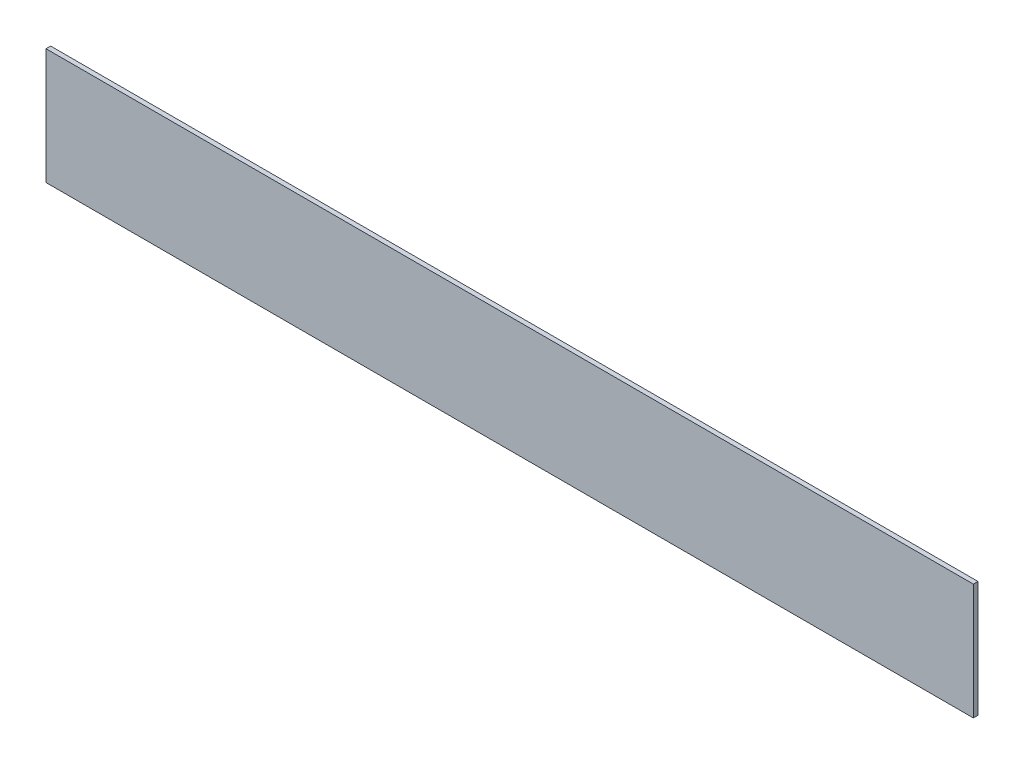
ISO-10303-21;
HEADER;
FILE_DESCRIPTION(('STEP AP214'),'2;1');
FILE_NAME('part.step','',(''),(''),'','','');
FILE_SCHEMA(('AUTOMOTIVE_DESIGN { 1 0 10303 214 1 1 1 1 }'));
ENDSEC;
DATA;
#1=APPLICATION_CONTEXT('core data for automotive mechanical design processes');
#2=APPLICATION_PROTOCOL_DEFINITION('international standard','automotive_design',2000,#1);
#3=PRODUCT_CONTEXT('',#1,'mechanical');
#4=PRODUCT('Part','Part','',(#3));
#5=PRODUCT_RELATED_PRODUCT_CATEGORY('part','',(#4));
#6=PRODUCT_DEFINITION_FORMATION('','',#4);
#7=PRODUCT_DEFINITION_CONTEXT('part definition',#1,'design');
#8=PRODUCT_DEFINITION('design','',#6,#7);
#9=PRODUCT_DEFINITION_SHAPE('','',#8);
#10=(LENGTH_UNIT() NAMED_UNIT(*) SI_UNIT(.MILLI.,.METRE.));
#11=(NAMED_UNIT(*) PLANE_ANGLE_UNIT() SI_UNIT($,.RADIAN.));
#12=(NAMED_UNIT(*) SI_UNIT($,.STERADIAN.) SOLID_ANGLE_UNIT());
#13=UNCERTAINTY_MEASURE_WITH_UNIT(LENGTH_MEASURE(1.E-05),#10,'distance_accuracy_value','');
#14=(GEOMETRIC_REPRESENTATION_CONTEXT(3) GLOBAL_UNCERTAINTY_ASSIGNED_CONTEXT((#13)) GLOBAL_UNIT_ASSIGNED_CONTEXT((#10,
#11,#12)) REPRESENTATION_CONTEXT('',''));
#15=CARTESIAN_POINT('',(0.,0.,0.));
#16=DIRECTION('',(0.,0.,1.));
#17=DIRECTION('',(1.,0.,0.));
#18=AXIS2_PLACEMENT_3D('',#15,#16,#17);
#19=CARTESIAN_POINT('',(0.,41.6,1.6));
#20=DIRECTION('',(1.,0.,0.));
#21=DIRECTION('',(0.,0.,-1.));
#22=AXIS2_PLACEMENT_3D('',#19,#20,#21);
#23=PLANE('',#22);
#24=DIRECTION('',(0.,-1.,0.));
#25=VECTOR('',#24,1.);
#26=CARTESIAN_POINT('',(0.,41.6,0.));
#27=LINE('',#26,#25);
#28=CARTESIAN_POINT('',(0.,81.6,0.));
#29=VERTEX_POINT('',#28);
#30=CARTESIAN_POINT('',(0.,41.6,0.));
#31=VERTEX_POINT('',#30);
#32=EDGE_CURVE('E102',#29,#31,#27,.T.);
#33=ORIENTED_EDGE('',*,*,#32,.T.);
#34=DIRECTION('',(0.,0.,-1.));
#35=VECTOR('',#34,1.);
#36=CARTESIAN_POINT('',(0.,41.6,1.6));
#37=LINE('',#36,#35);
#38=CARTESIAN_POINT('',(0.,41.6,1.6));
#39=VERTEX_POINT('',#38);
#40=EDGE_CURVE('E11',#39,#31,#37,.T.);
#41=ORIENTED_EDGE('',*,*,#40,.F.);
#42=DIRECTION('',(0.,-1.,0.));
#43=VECTOR('',#42,1.);
#44=CARTESIAN_POINT('',(0.,41.6,1.6));
#45=LINE('',#44,#43);
#46=CARTESIAN_POINT('',(0.,81.6,1.6));
#47=VERTEX_POINT('',#46);
#48=EDGE_CURVE('E90',#47,#39,#45,.T.);
#49=ORIENTED_EDGE('',*,*,#48,.F.);
#50=DIRECTION('',(0.,0.,-1.));
#51=VECTOR('',#50,1.);
#52=CARTESIAN_POINT('',(0.,81.6,1.6));
#53=LINE('',#52,#51);
#54=EDGE_CURVE('E98',#47,#29,#53,.T.);
#55=ORIENTED_EDGE('',*,*,#54,.T.);
#56=EDGE_LOOP('',(#33,#41,#49,#55));
#57=FACE_BOUND('',#56,.T.);
#58=ADVANCED_FACE('F39',(#57),#23,.F.);
#59=CARTESIAN_POINT('',(0.,41.6,1.6));
#60=DIRECTION('',(0.,1.,0.));
#61=DIRECTION('',(0.,0.,1.));
#62=AXIS2_PLACEMENT_3D('',#59,#60,#61);
#63=PLANE('',#62);
#64=DIRECTION('',(1.,0.,0.));
#65=VECTOR('',#64,1.);
#66=CARTESIAN_POINT('',(0.,41.6,0.));
#67=LINE('',#66,#65);
#68=CARTESIAN_POINT('',(320.,41.6,0.));
#69=VERTEX_POINT('',#68);
#70=EDGE_CURVE('E94',#31,#69,#67,.T.);
#71=ORIENTED_EDGE('',*,*,#70,.T.);
#72=DIRECTION('',(0.,0.,-1.));
#73=VECTOR('',#72,1.);
#74=CARTESIAN_POINT('',(320.,41.6,1.6));
#75=LINE('',#74,#73);
#76=CARTESIAN_POINT('',(320.,41.6,1.6));
#77=VERTEX_POINT('',#76);
#78=EDGE_CURVE('E47',#77,#69,#75,.T.);
#79=ORIENTED_EDGE('',*,*,#78,.F.);
#80=DIRECTION('',(1.,0.,0.));
#81=VECTOR('',#80,1.);
#82=CARTESIAN_POINT('',(0.,41.6,1.6));
#83=LINE('',#82,#81);
#84=EDGE_CURVE('E85',#39,#77,#83,.T.);
#85=ORIENTED_EDGE('',*,*,#84,.F.);
#86=ORIENTED_EDGE('',*,*,#40,.T.);
#87=EDGE_LOOP('',(#71,#79,#85,#86));
#88=FACE_BOUND('',#87,.T.);
#89=ADVANCED_FACE('F93',(#88),#63,.F.);
#90=CARTESIAN_POINT('',(320.,41.6,1.6));
#91=DIRECTION('',(-1.,0.,0.));
#92=DIRECTION('',(0.,0.,1.));
#93=AXIS2_PLACEMENT_3D('',#90,#91,#92);
#94=PLANE('',#93);
#95=DIRECTION('',(0.,1.,0.));
#96=VECTOR('',#95,1.);
#97=CARTESIAN_POINT('',(320.,41.6,0.));
#98=LINE('',#97,#96);
#99=CARTESIAN_POINT('',(320.,81.6,0.));
#100=VERTEX_POINT('',#99);
#101=EDGE_CURVE('E72',#69,#100,#98,.T.);
#102=ORIENTED_EDGE('',*,*,#101,.T.);
#103=DIRECTION('',(0.,0.,-1.));
#104=VECTOR('',#103,1.);
#105=CARTESIAN_POINT('',(320.,81.6,1.6));
#106=LINE('',#105,#104);
#107=CARTESIAN_POINT('',(320.,81.6,1.6));
#108=VERTEX_POINT('',#107);
#109=EDGE_CURVE('E95',#108,#100,#106,.T.);
#110=ORIENTED_EDGE('',*,*,#109,.F.);
#111=DIRECTION('',(0.,1.,0.));
#112=VECTOR('',#111,1.);
#113=CARTESIAN_POINT('',(320.,41.6,1.6));
#114=LINE('',#113,#112);
#115=EDGE_CURVE('E88',#77,#108,#114,.T.);
#116=ORIENTED_EDGE('',*,*,#115,.F.);
#117=ORIENTED_EDGE('',*,*,#78,.T.);
#118=EDGE_LOOP('',(#102,#110,#116,#117));
#119=FACE_BOUND('',#118,.T.);
#120=ADVANCED_FACE('F96',(#119),#94,.F.);
#121=CARTESIAN_POINT('',(0.,81.6,1.6));
#122=DIRECTION('',(0.,-1.,0.));
#123=DIRECTION('',(0.,0.,-1.));
#124=AXIS2_PLACEMENT_3D('',#121,#122,#123);
#125=PLANE('',#124);
#126=DIRECTION('',(-1.,0.,0.));
#127=VECTOR('',#126,1.);
#128=CARTESIAN_POINT('',(0.,81.6,0.));
#129=LINE('',#128,#127);
#130=EDGE_CURVE('E78',#100,#29,#129,.T.);
#131=ORIENTED_EDGE('',*,*,#130,.T.);
#132=ORIENTED_EDGE('',*,*,#54,.F.);
#133=DIRECTION('',(-1.,0.,0.));
#134=VECTOR('',#133,1.);
#135=CARTESIAN_POINT('',(0.,81.6,1.6));
#136=LINE('',#135,#134);
#137=EDGE_CURVE('E55',#108,#47,#136,.T.);
#138=ORIENTED_EDGE('',*,*,#137,.F.);
#139=ORIENTED_EDGE('',*,*,#109,.T.);
#140=EDGE_LOOP('',(#131,#132,#138,#139));
#141=FACE_BOUND('',#140,.T.);
#142=ADVANCED_FACE('F109',(#141),#125,.F.);
#143=CARTESIAN_POINT('',(0.,0.,1.6));
#144=DIRECTION('',(0.,0.,-1.));
#145=DIRECTION('',(-1.,0.,0.));
#146=AXIS2_PLACEMENT_3D('',#143,#144,#145);
#147=PLANE('',#146);
#148=ORIENTED_EDGE('',*,*,#48,.T.);
#149=ORIENTED_EDGE('',*,*,#84,.T.);
#150=ORIENTED_EDGE('',*,*,#115,.T.);
#151=ORIENTED_EDGE('',*,*,#137,.T.);
#152=EDGE_LOOP('',(#148,#149,#150,#151));
#153=FACE_BOUND('',#152,.T.);
#154=ADVANCED_FACE('F86',(#153),#147,.F.);
#155=CARTESIAN_POINT('',(0.,0.,0.));
#156=DIRECTION('',(0.,0.,-1.));
#157=DIRECTION('',(-1.,0.,0.));
#158=AXIS2_PLACEMENT_3D('',#155,#156,#157);
#159=PLANE('',#158);
#160=ORIENTED_EDGE('',*,*,#32,.F.);
#161=ORIENTED_EDGE('',*,*,#130,.F.);
#162=ORIENTED_EDGE('',*,*,#101,.F.);
#163=ORIENTED_EDGE('',*,*,#70,.F.);
#164=EDGE_LOOP('',(#160,#161,#162,#163));
#165=FACE_BOUND('',#164,.T.);
#166=ADVANCED_FACE('F112',(#165),#159,.T.);
#167=CLOSED_SHELL('',(#58,#89,#120,#142,#154,#166));
#168=MANIFOLD_SOLID_BREP('B2',#167);
#169=ADVANCED_BREP_SHAPE_REPRESENTATION('',(#18,#168),#14);
#170=SHAPE_DEFINITION_REPRESENTATION(#9,#169);
ENDSEC;
END-ISO-10303-21;
